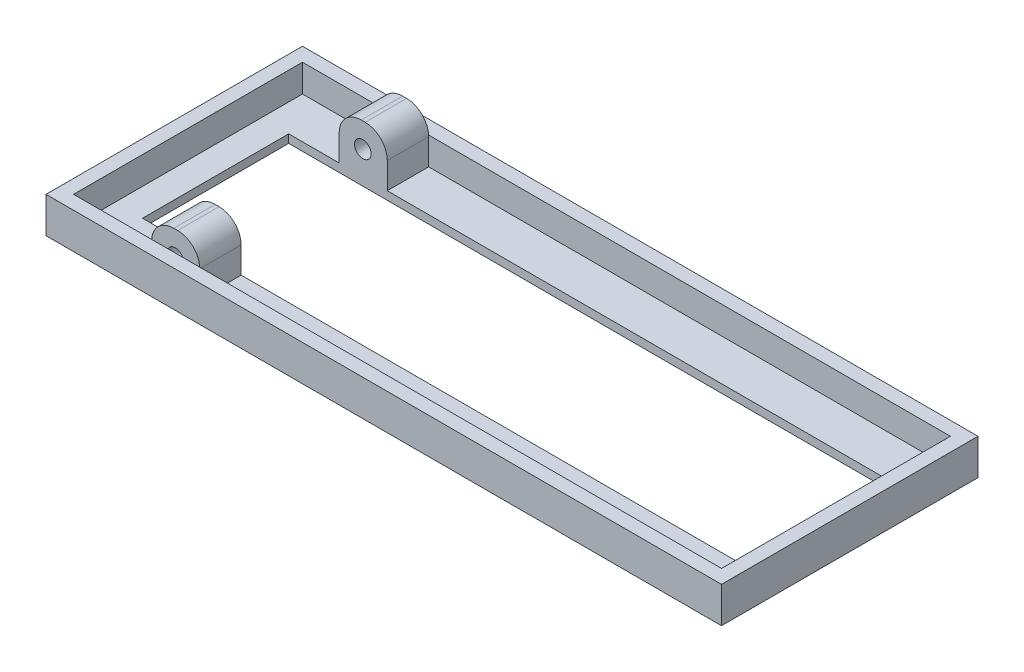
ISO-10303-21;
HEADER;
FILE_DESCRIPTION(('STEP AP214'),'2;1');
FILE_NAME('part.step','',(''),(''),'','','');
FILE_SCHEMA(('AUTOMOTIVE_DESIGN { 1 0 10303 214 1 1 1 1 }'));
ENDSEC;
DATA;
#1=APPLICATION_CONTEXT('core data for automotive mechanical design processes');
#2=APPLICATION_PROTOCOL_DEFINITION('international standard','automotive_design',2000,#1);
#3=PRODUCT_CONTEXT('',#1,'mechanical');
#4=PRODUCT('Part','Part','',(#3));
#5=PRODUCT_RELATED_PRODUCT_CATEGORY('part','',(#4));
#6=PRODUCT_DEFINITION_FORMATION('','',#4);
#7=PRODUCT_DEFINITION_CONTEXT('part definition',#1,'design');
#8=PRODUCT_DEFINITION('design','',#6,#7);
#9=PRODUCT_DEFINITION_SHAPE('','',#8);
#10=(LENGTH_UNIT() NAMED_UNIT(*) SI_UNIT(.MILLI.,.METRE.));
#11=(NAMED_UNIT(*) PLANE_ANGLE_UNIT() SI_UNIT($,.RADIAN.));
#12=(NAMED_UNIT(*) SI_UNIT($,.STERADIAN.) SOLID_ANGLE_UNIT());
#13=UNCERTAINTY_MEASURE_WITH_UNIT(LENGTH_MEASURE(1.E-05),#10,'distance_accuracy_value','');
#14=(GEOMETRIC_REPRESENTATION_CONTEXT(3) GLOBAL_UNCERTAINTY_ASSIGNED_CONTEXT((#13)) GLOBAL_UNIT_ASSIGNED_CONTEXT((#10,
#11,#12)) REPRESENTATION_CONTEXT('',''));
#15=CARTESIAN_POINT('',(0.,0.,0.));
#16=DIRECTION('',(0.,0.,1.));
#17=DIRECTION('',(1.,0.,0.));
#18=AXIS2_PLACEMENT_3D('',#15,#16,#17);
#19=CARTESIAN_POINT('',(1275.81442908691,30.,-600.220757140236));
#20=DIRECTION('',(0.,0.,-1.));
#21=DIRECTION('',(-1.,0.,0.));
#22=AXIS2_PLACEMENT_3D('',#19,#20,#21);
#23=PLANE('',#22);
#24=DIRECTION('',(-1.,0.,0.));
#25=VECTOR('',#24,1.);
#26=CARTESIAN_POINT('',(1458.88627271866,205.,-600.220757140236));
#27=LINE('',#26,#25);
#28=CARTESIAN_POINT('',(1553.30337059465,205.,-600.220757140236));
#29=VERTEX_POINT('',#28);
#30=CARTESIAN_POINT('',(1538.88627271866,205.,-600.220757140236));
#31=VERTEX_POINT('',#30);
#32=EDGE_CURVE('E460',#29,#31,#27,.T.);
#33=ORIENTED_EDGE('',*,*,#32,.F.);
#34=CARTESIAN_POINT('',(1553.30337059465,125.,-600.220757140236));
#35=DIRECTION('',(0.,0.,-1.));
#36=DIRECTION('',(-1.,0.,0.));
#37=AXIS2_PLACEMENT_3D('',#34,#35,#36);
#38=CIRCLE('',#37,80.);
#39=CARTESIAN_POINT('',(1633.30337059465,125.,-600.220757140236));
#40=VERTEX_POINT('',#39);
#41=EDGE_CURVE('E364',#29,#40,#38,.T.);
#42=ORIENTED_EDGE('',*,*,#41,.T.);
#43=DIRECTION('',(0.,-1.,0.));
#44=VECTOR('',#43,1.);
#45=CARTESIAN_POINT('',(1633.30337059465,205.,-600.220757140236));
#46=LINE('',#45,#44);
#47=CARTESIAN_POINT('',(1633.30337059465,30.,-600.220757140236));
#48=VERTEX_POINT('',#47);
#49=EDGE_CURVE('E427',#40,#48,#46,.T.);
#50=ORIENTED_EDGE('',*,*,#49,.T.);
#51=DIRECTION('',(1.,0.,0.));
#52=VECTOR('',#51,1.);
#53=CARTESIAN_POINT('',(1275.81442908691,30.,-600.220757140236));
#54=LINE('',#53,#52);
#55=CARTESIAN_POINT('',(3425.3144290869,30.,-600.220757140236));
#56=VERTEX_POINT('',#55);
#57=EDGE_CURVE('E293',#48,#56,#54,.T.);
#58=ORIENTED_EDGE('',*,*,#57,.T.);
#59=DIRECTION('',(0.,-1.,0.));
#60=VECTOR('',#59,1.);
#61=CARTESIAN_POINT('',(3425.3144290869,30.,-600.220757140236));
#62=LINE('',#61,#60);
#63=CARTESIAN_POINT('',(3425.3144290869,0.,-600.220757140236));
#64=VERTEX_POINT('',#63);
#65=EDGE_CURVE('E320',#56,#64,#62,.T.);
#66=ORIENTED_EDGE('',*,*,#65,.T.);
#67=DIRECTION('',(1.,0.,0.));
#68=VECTOR('',#67,1.);
#69=CARTESIAN_POINT('',(1275.81442908691,0.,-600.220757140236));
#70=LINE('',#69,#68);
#71=CARTESIAN_POINT('',(1275.81442908691,0.,-600.220757140236));
#72=VERTEX_POINT('',#71);
#73=EDGE_CURVE('E308',#72,#64,#70,.T.);
#74=ORIENTED_EDGE('',*,*,#73,.F.);
#75=DIRECTION('',(0.,-1.,0.));
#76=VECTOR('',#75,1.);
#77=CARTESIAN_POINT('',(1275.81442908691,30.,-600.220757140236));
#78=LINE('',#77,#76);
#79=CARTESIAN_POINT('',(1275.81442908691,30.,-600.220757140236));
#80=VERTEX_POINT('',#79);
#81=EDGE_CURVE('E322',#80,#72,#78,.T.);
#82=ORIENTED_EDGE('',*,*,#81,.F.);
#83=CARTESIAN_POINT('',(1458.88627271866,30.,-600.220757140236));
#84=VERTEX_POINT('',#83);
#85=EDGE_CURVE('E295',#80,#84,#54,.T.);
#86=ORIENTED_EDGE('',*,*,#85,.T.);
#87=DIRECTION('',(0.,-1.,0.));
#88=VECTOR('',#87,1.);
#89=CARTESIAN_POINT('',(1458.88627271866,205.,-600.220757140236));
#90=LINE('',#89,#88);
#91=CARTESIAN_POINT('',(1458.88627271866,125.,-600.220757140236));
#92=VERTEX_POINT('',#91);
#93=EDGE_CURVE('E464',#92,#84,#90,.T.);
#94=ORIENTED_EDGE('',*,*,#93,.F.);
#95=CARTESIAN_POINT('',(1538.88627271866,125.,-600.220757140236));
#96=DIRECTION('',(0.,0.,-1.));
#97=DIRECTION('',(-1.,0.,0.));
#98=AXIS2_PLACEMENT_3D('',#95,#96,#97);
#99=CIRCLE('',#98,80.);
#100=EDGE_CURVE('E362',#92,#31,#99,.T.);
#101=ORIENTED_EDGE('',*,*,#100,.T.);
#102=EDGE_LOOP('',(#33,#42,#50,#58,#66,#74,#82,#86,#94,#101));
#103=FACE_BOUND('',#102,.T.);
#104=CARTESIAN_POINT('',(1544.62599986394,116.419579705896,-600.220757140236));
#105=DIRECTION('',(0.,0.,-1.));
#106=DIRECTION('',(-1.,0.,0.));
#107=AXIS2_PLACEMENT_3D('',#104,#105,#106);
#108=CIRCLE('',#107,30.);
#109=CARTESIAN_POINT('',(1514.62599986394,116.419579705896,-600.220757140236));
#110=VERTEX_POINT('',#109);
#111=EDGE_CURVE('E453',#110,#110,#108,.F.);
#112=ORIENTED_EDGE('',*,*,#111,.T.);
#113=EDGE_LOOP('',(#112));
#114=FACE_BOUND('',#113,.T.);
#115=ADVANCED_FACE('F32',(#103,#114),#23,.T.);
#116=CARTESIAN_POINT('',(1275.81442908691,30.,-1130.22075714024));
#117=DIRECTION('',(0.,0.,1.));
#118=DIRECTION('',(1.,0.,0.));
#119=AXIS2_PLACEMENT_3D('',#116,#117,#118);
#120=PLANE('',#119);
#121=DIRECTION('',(1.,0.,0.));
#122=VECTOR('',#121,1.);
#123=CARTESIAN_POINT('',(1458.88627271866,205.,-1130.22075714024));
#124=LINE('',#123,#122);
#125=CARTESIAN_POINT('',(1538.88627271866,205.,-1130.22075714024));
#126=VERTEX_POINT('',#125);
#127=CARTESIAN_POINT('',(1553.30337059465,205.,-1130.22075714024));
#128=VERTEX_POINT('',#127);
#129=EDGE_CURVE('E418',#126,#128,#124,.T.);
#130=ORIENTED_EDGE('',*,*,#129,.F.);
#131=CARTESIAN_POINT('',(1538.88627271866,125.,-1130.22075714024));
#132=DIRECTION('',(0.,0.,1.));
#133=DIRECTION('',(1.,0.,0.));
#134=AXIS2_PLACEMENT_3D('',#131,#132,#133);
#135=CIRCLE('',#134,80.);
#136=CARTESIAN_POINT('',(1458.88627271866,125.,-1130.22075714024));
#137=VERTEX_POINT('',#136);
#138=EDGE_CURVE('E381',#126,#137,#135,.T.);
#139=ORIENTED_EDGE('',*,*,#138,.T.);
#140=DIRECTION('',(0.,-1.,0.));
#141=VECTOR('',#140,1.);
#142=CARTESIAN_POINT('',(1458.88627271866,205.,-1130.22075714024));
#143=LINE('',#142,#141);
#144=CARTESIAN_POINT('',(1458.88627271866,30.,-1130.22075714024));
#145=VERTEX_POINT('',#144);
#146=EDGE_CURVE('E433',#137,#145,#143,.T.);
#147=ORIENTED_EDGE('',*,*,#146,.T.);
#148=DIRECTION('',(-1.,0.,0.));
#149=VECTOR('',#148,1.);
#150=CARTESIAN_POINT('',(1275.81442908691,30.,-1130.22075714024));
#151=LINE('',#150,#149);
#152=CARTESIAN_POINT('',(1275.81442908691,30.,-1130.22075714024));
#153=VERTEX_POINT('',#152);
#154=EDGE_CURVE('E301',#145,#153,#151,.T.);
#155=ORIENTED_EDGE('',*,*,#154,.T.);
#156=DIRECTION('',(0.,-1.,0.));
#157=VECTOR('',#156,1.);
#158=CARTESIAN_POINT('',(1275.81442908691,30.,-1130.22075714024));
#159=LINE('',#158,#157);
#160=CARTESIAN_POINT('',(1275.81442908691,0.,-1130.22075714024));
#161=VERTEX_POINT('',#160);
#162=EDGE_CURVE('E305',#153,#161,#159,.T.);
#163=ORIENTED_EDGE('',*,*,#162,.T.);
#164=DIRECTION('',(-1.,0.,0.));
#165=VECTOR('',#164,1.);
#166=CARTESIAN_POINT('',(1275.81442908691,0.,-1130.22075714024));
#167=LINE('',#166,#165);
#168=CARTESIAN_POINT('',(3425.3144290869,0.,-1130.22075714024));
#169=VERTEX_POINT('',#168);
#170=EDGE_CURVE('E294',#169,#161,#167,.T.);
#171=ORIENTED_EDGE('',*,*,#170,.F.);
#172=DIRECTION('',(0.,-1.,0.));
#173=VECTOR('',#172,1.);
#174=CARTESIAN_POINT('',(3425.3144290869,30.,-1130.22075714024));
#175=LINE('',#174,#173);
#176=CARTESIAN_POINT('',(3425.3144290869,30.,-1130.22075714024));
#177=VERTEX_POINT('',#176);
#178=EDGE_CURVE('E318',#177,#169,#175,.T.);
#179=ORIENTED_EDGE('',*,*,#178,.F.);
#180=CARTESIAN_POINT('',(1633.30337059465,30.,-1130.22075714024));
#181=VERTEX_POINT('',#180);
#182=EDGE_CURVE('E302',#177,#181,#151,.T.);
#183=ORIENTED_EDGE('',*,*,#182,.T.);
#184=DIRECTION('',(0.,-1.,0.));
#185=VECTOR('',#184,1.);
#186=CARTESIAN_POINT('',(1633.30337059465,205.,-1130.22075714024));
#187=LINE('',#186,#185);
#188=CARTESIAN_POINT('',(1633.30337059465,125.,-1130.22075714024));
#189=VERTEX_POINT('',#188);
#190=EDGE_CURVE('E421',#189,#181,#187,.T.);
#191=ORIENTED_EDGE('',*,*,#190,.F.);
#192=CARTESIAN_POINT('',(1553.30337059465,125.,-1130.22075714024));
#193=DIRECTION('',(0.,0.,1.));
#194=DIRECTION('',(1.,0.,0.));
#195=AXIS2_PLACEMENT_3D('',#192,#193,#194);
#196=CIRCLE('',#195,80.);
#197=EDGE_CURVE('E379',#189,#128,#196,.T.);
#198=ORIENTED_EDGE('',*,*,#197,.T.);
#199=EDGE_LOOP('',(#130,#139,#147,#155,#163,#171,#179,#183,#191,#198));
#200=FACE_BOUND('',#199,.T.);
#201=CARTESIAN_POINT('',(1544.62599986394,116.419579705896,-1130.22075714024));
#202=DIRECTION('',(0.,0.,1.));
#203=DIRECTION('',(1.,0.,0.));
#204=AXIS2_PLACEMENT_3D('',#201,#202,#203);
#205=CIRCLE('',#204,30.);
#206=CARTESIAN_POINT('',(1574.62599986394,116.419579705896,-1130.22075714024));
#207=VERTEX_POINT('',#206);
#208=EDGE_CURVE('E237',#207,#207,#205,.F.);
#209=ORIENTED_EDGE('',*,*,#208,.T.);
#210=EDGE_LOOP('',(#209));
#211=FACE_BOUND('',#210,.T.);
#212=ADVANCED_FACE('F500',(#200,#211),#120,.T.);
#213=CARTESIAN_POINT('',(1458.88627271866,205.,-1280.22075714024));
#214=DIRECTION('',(0.,0.,1.));
#215=DIRECTION('',(1.,0.,0.));
#216=AXIS2_PLACEMENT_3D('',#213,#214,#215);
#217=PLANE('',#216);
#218=DIRECTION('',(-1.,0.,0.));
#219=VECTOR('',#218,1.);
#220=CARTESIAN_POINT('',(1175.81442908691,130.,-1280.22075714024));
#221=LINE('',#220,#219);
#222=CARTESIAN_POINT('',(1517.87581884333,130.,-1280.22075714024));
#223=VERTEX_POINT('',#222);
#224=CARTESIAN_POINT('',(1459.0426756053,130.,-1280.22075714024));
#225=VERTEX_POINT('',#224);
#226=EDGE_CURVE('E412',#223,#225,#221,.T.);
#227=ORIENTED_EDGE('',*,*,#226,.T.);
#228=CARTESIAN_POINT('',(1538.88627271866,125.,-1280.22075714024));
#229=DIRECTION('',(0.,0.,1.));
#230=DIRECTION('',(1.,0.,0.));
#231=AXIS2_PLACEMENT_3D('',#228,#229,#230);
#232=CIRCLE('',#231,80.);
#233=CARTESIAN_POINT('',(1538.88627271866,205.,-1280.22075714024));
#234=VERTEX_POINT('',#233);
#235=EDGE_CURVE('E388',#225,#234,#232,.F.);
#236=ORIENTED_EDGE('',*,*,#235,.T.);
#237=DIRECTION('',(-1.,0.,0.));
#238=VECTOR('',#237,1.);
#239=CARTESIAN_POINT('',(1458.88627271866,205.,-1280.22075714024));
#240=LINE('',#239,#238);
#241=CARTESIAN_POINT('',(1553.30337059465,205.,-1280.22075714024));
#242=VERTEX_POINT('',#241);
#243=EDGE_CURVE('E410',#242,#234,#240,.T.);
#244=ORIENTED_EDGE('',*,*,#243,.F.);
#245=CARTESIAN_POINT('',(1553.30337059465,125.,-1280.22075714024));
#246=DIRECTION('',(0.,0.,1.));
#247=DIRECTION('',(1.,0.,0.));
#248=AXIS2_PLACEMENT_3D('',#245,#246,#247);
#249=CIRCLE('',#248,80.);
#250=CARTESIAN_POINT('',(1633.14696770801,130.,-1280.22075714024));
#251=VERTEX_POINT('',#250);
#252=EDGE_CURVE('E385',#242,#251,#249,.F.);
#253=ORIENTED_EDGE('',*,*,#252,.T.);
#254=CARTESIAN_POINT('',(1571.37618088455,130.,-1280.22075714024));
#255=VERTEX_POINT('',#254);
#256=EDGE_CURVE('E436',#251,#255,#221,.T.);
#257=ORIENTED_EDGE('',*,*,#256,.T.);
#258=CARTESIAN_POINT('',(1544.62599986394,116.419579705896,-1280.22075714024));
#259=DIRECTION('',(0.,0.,1.));
#260=DIRECTION('',(1.,0.,0.));
#261=AXIS2_PLACEMENT_3D('',#258,#259,#260);
#262=CIRCLE('',#261,30.);
#263=EDGE_CURVE('E234',#255,#223,#262,.T.);
#264=ORIENTED_EDGE('',*,*,#263,.T.);
#265=EDGE_LOOP('',(#227,#236,#244,#253,#257,#264));
#266=FACE_BOUND('',#265,.T.);
#267=ADVANCED_FACE('F409',(#266),#217,.F.);
#268=CARTESIAN_POINT('',(1458.88627271866,205.,-450.220757140228));
#269=DIRECTION('',(0.,0.,-1.));
#270=DIRECTION('',(-1.,0.,0.));
#271=AXIS2_PLACEMENT_3D('',#268,#269,#270);
#272=PLANE('',#271);
#273=DIRECTION('',(1.,0.,0.));
#274=VECTOR('',#273,1.);
#275=CARTESIAN_POINT('',(1175.81442908691,130.,-450.220757140236));
#276=LINE('',#275,#274);
#277=CARTESIAN_POINT('',(1571.37618088455,130.,-450.220757140228));
#278=VERTEX_POINT('',#277);
#279=CARTESIAN_POINT('',(1633.14696770801,130.,-450.220757140238));
#280=VERTEX_POINT('',#279);
#281=EDGE_CURVE('E228',#278,#280,#276,.T.);
#282=ORIENTED_EDGE('',*,*,#281,.T.);
#283=CARTESIAN_POINT('',(1553.30337059465,125.,-450.220757140228));
#284=DIRECTION('',(0.,0.,-1.));
#285=DIRECTION('',(-1.,0.,0.));
#286=AXIS2_PLACEMENT_3D('',#283,#284,#285);
#287=CIRCLE('',#286,80.);
#288=CARTESIAN_POINT('',(1553.30337059465,205.,-450.220757140228));
#289=VERTEX_POINT('',#288);
#290=EDGE_CURVE('E369',#280,#289,#287,.F.);
#291=ORIENTED_EDGE('',*,*,#290,.T.);
#292=DIRECTION('',(1.,0.,0.));
#293=VECTOR('',#292,1.);
#294=CARTESIAN_POINT('',(1458.88627271866,205.,-450.220757140228));
#295=LINE('',#294,#293);
#296=CARTESIAN_POINT('',(1538.88627271866,205.,-450.220757140228));
#297=VERTEX_POINT('',#296);
#298=EDGE_CURVE('E457',#297,#289,#295,.T.);
#299=ORIENTED_EDGE('',*,*,#298,.F.);
#300=CARTESIAN_POINT('',(1538.88627271866,125.,-450.220757140228));
#301=DIRECTION('',(0.,0.,-1.));
#302=DIRECTION('',(-1.,0.,0.));
#303=AXIS2_PLACEMENT_3D('',#300,#301,#302);
#304=CIRCLE('',#303,80.);
#305=CARTESIAN_POINT('',(1459.0426756053,130.,-450.220757140237));
#306=VERTEX_POINT('',#305);
#307=EDGE_CURVE('E221',#297,#306,#304,.F.);
#308=ORIENTED_EDGE('',*,*,#307,.T.);
#309=CARTESIAN_POINT('',(1517.87581884333,130.,-450.220757140235));
#310=VERTEX_POINT('',#309);
#311=EDGE_CURVE('E213',#306,#310,#276,.T.);
#312=ORIENTED_EDGE('',*,*,#311,.T.);
#313=CARTESIAN_POINT('',(1544.62599986394,116.419579705896,-450.220757140235));
#314=DIRECTION('',(0.,0.,1.));
#315=DIRECTION('',(1.,0.,0.));
#316=AXIS2_PLACEMENT_3D('',#313,#314,#315);
#317=CIRCLE('',#316,30.);
#318=EDGE_CURVE('E218',#278,#310,#317,.T.);
#319=ORIENTED_EDGE('',*,*,#318,.F.);
#320=EDGE_LOOP('',(#282,#291,#299,#308,#312,#319));
#321=FACE_BOUND('',#320,.T.);
#322=ADVANCED_FACE('F216',(#321),#272,.F.);
#323=CARTESIAN_POINT('',(0.,30.,0.));
#324=DIRECTION('',(0.,1.,0.));
#325=DIRECTION('',(0.,0.,1.));
#326=AXIS2_PLACEMENT_3D('',#323,#324,#325);
#327=PLANE('',#326);
#328=DIRECTION('',(1.,0.,0.));
#329=VECTOR('',#328,1.);
#330=CARTESIAN_POINT('',(1175.81442908691,30.,-450.220757140236));
#331=LINE('',#330,#329);
#332=CARTESIAN_POINT('',(1175.81442908691,30.,-450.220757140236));
#333=VERTEX_POINT('',#332);
#334=CARTESIAN_POINT('',(1458.88627271866,30.,-450.220757140228));
#335=VERTEX_POINT('',#334);
#336=EDGE_CURVE('E266',#333,#335,#331,.T.);
#337=ORIENTED_EDGE('',*,*,#336,.T.);
#338=DIRECTION('',(0.,0.,1.));
#339=VECTOR('',#338,1.);
#340=CARTESIAN_POINT('',(1458.88627271866,30.,-600.220757140236));
#341=LINE('',#340,#339);
#342=EDGE_CURVE('E456',#84,#335,#341,.T.);
#343=ORIENTED_EDGE('',*,*,#342,.F.);
#344=ORIENTED_EDGE('',*,*,#85,.F.);
#345=DIRECTION('',(0.,0.,1.));
#346=VECTOR('',#345,1.);
#347=CARTESIAN_POINT('',(1275.81442908691,30.,-1130.22075714024));
#348=LINE('',#347,#346);
#349=EDGE_CURVE('E291',#153,#80,#348,.T.);
#350=ORIENTED_EDGE('',*,*,#349,.F.);
#351=ORIENTED_EDGE('',*,*,#154,.F.);
#352=DIRECTION('',(0.,0.,1.));
#353=VECTOR('',#352,1.);
#354=CARTESIAN_POINT('',(1458.88627271866,30.,-1130.22075714024));
#355=LINE('',#354,#353);
#356=CARTESIAN_POINT('',(1458.88627271866,30.,-1280.22075714024));
#357=VERTEX_POINT('',#356);
#358=EDGE_CURVE('E419',#357,#145,#355,.T.);
#359=ORIENTED_EDGE('',*,*,#358,.F.);
#360=DIRECTION('',(-1.,0.,0.));
#361=VECTOR('',#360,1.);
#362=CARTESIAN_POINT('',(1175.81442908691,30.,-1280.22075714024));
#363=LINE('',#362,#361);
#364=CARTESIAN_POINT('',(1175.81442908691,30.,-1280.22075714024));
#365=VERTEX_POINT('',#364);
#366=EDGE_CURVE('E263',#357,#365,#363,.T.);
#367=ORIENTED_EDGE('',*,*,#366,.T.);
#368=DIRECTION('',(0.,0.,1.));
#369=VECTOR('',#368,1.);
#370=CARTESIAN_POINT('',(1175.81442908691,30.,-1280.22075714024));
#371=LINE('',#370,#369);
#372=EDGE_CURVE('E262',#365,#333,#371,.T.);
#373=ORIENTED_EDGE('',*,*,#372,.T.);
#374=EDGE_LOOP('',(#337,#343,#344,#350,#351,#359,#367,#373));
#375=FACE_BOUND('',#374,.T.);
#376=ADVANCED_FACE('F504',(#375),#327,.T.);
#377=ORIENTED_EDGE('',*,*,#57,.F.);
#378=DIRECTION('',(0.,0.,-1.));
#379=VECTOR('',#378,1.);
#380=CARTESIAN_POINT('',(1633.30337059465,30.,-600.220757140236));
#381=LINE('',#380,#379);
#382=CARTESIAN_POINT('',(1633.30337059465,30.,-450.220757140228));
#383=VERTEX_POINT('',#382);
#384=EDGE_CURVE('E461',#383,#48,#381,.T.);
#385=ORIENTED_EDGE('',*,*,#384,.F.);
#386=CARTESIAN_POINT('',(3525.31442908691,30.,-450.220757140244));
#387=VERTEX_POINT('',#386);
#388=EDGE_CURVE('E265',#383,#387,#331,.T.);
#389=ORIENTED_EDGE('',*,*,#388,.T.);
#390=DIRECTION('',(0.,0.,-1.));
#391=VECTOR('',#390,1.);
#392=CARTESIAN_POINT('',(3525.3144290869,30.,-1280.22075714024));
#393=LINE('',#392,#391);
#394=CARTESIAN_POINT('',(3525.3144290869,30.,-1280.22075714024));
#395=VERTEX_POINT('',#394);
#396=EDGE_CURVE('E269',#387,#395,#393,.T.);
#397=ORIENTED_EDGE('',*,*,#396,.T.);
#398=CARTESIAN_POINT('',(1633.30337059465,30.,-1280.22075714024));
#399=VERTEX_POINT('',#398);
#400=EDGE_CURVE('E259',#395,#399,#363,.T.);
#401=ORIENTED_EDGE('',*,*,#400,.T.);
#402=DIRECTION('',(0.,0.,-1.));
#403=VECTOR('',#402,1.);
#404=CARTESIAN_POINT('',(1633.30337059465,30.,-1130.22075714024));
#405=LINE('',#404,#403);
#406=EDGE_CURVE('E424',#181,#399,#405,.T.);
#407=ORIENTED_EDGE('',*,*,#406,.F.);
#408=ORIENTED_EDGE('',*,*,#182,.F.);
#409=DIRECTION('',(0.,0.,-1.));
#410=VECTOR('',#409,1.);
#411=CARTESIAN_POINT('',(3425.3144290869,30.,-1130.22075714024));
#412=LINE('',#411,#410);
#413=EDGE_CURVE('E298',#56,#177,#412,.T.);
#414=ORIENTED_EDGE('',*,*,#413,.F.);
#415=EDGE_LOOP('',(#377,#385,#389,#397,#401,#407,#408,#414));
#416=FACE_BOUND('',#415,.T.);
#417=ADVANCED_FACE('F484',(#416),#327,.T.);
#418=CARTESIAN_POINT('',(1175.81442908691,130.,-450.220757140236));
#419=DIRECTION('',(0.,0.,-1.));
#420=DIRECTION('',(-1.,0.,0.));
#421=AXIS2_PLACEMENT_3D('',#418,#419,#420);
#422=PLANE('',#421);
#423=CARTESIAN_POINT('',(1175.81442908691,130.,-450.220757140236));
#424=VERTEX_POINT('',#423);
#425=EDGE_CURVE('E225',#424,#306,#276,.T.);
#426=ORIENTED_EDGE('',*,*,#425,.T.);
#427=CARTESIAN_POINT('',(1538.88627271866,125.,-450.220757140237));
#428=DIRECTION('',(0.,0.,-1.));
#429=DIRECTION('',(-1.,0.,0.));
#430=AXIS2_PLACEMENT_3D('',#427,#428,#429);
#431=CIRCLE('',#430,80.);
#432=CARTESIAN_POINT('',(1458.88627271866,125.,-450.220757140237));
#433=VERTEX_POINT('',#432);
#434=EDGE_CURVE('E394',#306,#433,#431,.F.);
#435=ORIENTED_EDGE('',*,*,#434,.T.);
#436=DIRECTION('',(0.,-1.,0.));
#437=VECTOR('',#436,1.);
#438=CARTESIAN_POINT('',(1458.88627271866,130.,-450.220757140237));
#439=LINE('',#438,#437);
#440=EDGE_CURVE('E354',#433,#335,#439,.T.);
#441=ORIENTED_EDGE('',*,*,#440,.T.);
#442=ORIENTED_EDGE('',*,*,#336,.F.);
#443=DIRECTION('',(0.,-1.,0.));
#444=VECTOR('',#443,1.);
#445=CARTESIAN_POINT('',(1175.81442908691,130.,-450.220757140236));
#446=LINE('',#445,#444);
#447=EDGE_CURVE('E272',#424,#333,#446,.T.);
#448=ORIENTED_EDGE('',*,*,#447,.F.);
#449=EDGE_LOOP('',(#426,#435,#441,#442,#448));
#450=FACE_BOUND('',#449,.T.);
#451=ADVANCED_FACE('F587',(#450),#422,.T.);
#452=ORIENTED_EDGE('',*,*,#388,.F.);
#453=DIRECTION('',(0.,1.,0.));
#454=VECTOR('',#453,1.);
#455=CARTESIAN_POINT('',(1633.30337059465,130.,-450.220757140238));
#456=LINE('',#455,#454);
#457=CARTESIAN_POINT('',(1633.30337059465,125.,-450.220757140238));
#458=VERTEX_POINT('',#457);
#459=EDGE_CURVE('E351',#383,#458,#456,.T.);
#460=ORIENTED_EDGE('',*,*,#459,.T.);
#461=CARTESIAN_POINT('',(1553.30337059465,125.,-450.220757140237));
#462=DIRECTION('',(0.,0.,-1.));
#463=DIRECTION('',(-1.,0.,0.));
#464=AXIS2_PLACEMENT_3D('',#461,#462,#463);
#465=CIRCLE('',#464,80.);
#466=EDGE_CURVE('E392',#458,#280,#465,.F.);
#467=ORIENTED_EDGE('',*,*,#466,.T.);
#468=CARTESIAN_POINT('',(3525.31442908691,130.,-450.220757140244));
#469=VERTEX_POINT('',#468);
#470=EDGE_CURVE('E239',#280,#469,#276,.T.);
#471=ORIENTED_EDGE('',*,*,#470,.T.);
#472=DIRECTION('',(0.,-1.,0.));
#473=VECTOR('',#472,1.);
#474=CARTESIAN_POINT('',(3525.31442908691,130.,-450.220757140244));
#475=LINE('',#474,#473);
#476=EDGE_CURVE('E256',#469,#387,#475,.T.);
#477=ORIENTED_EDGE('',*,*,#476,.T.);
#478=EDGE_LOOP('',(#452,#460,#467,#471,#477));
#479=FACE_BOUND('',#478,.T.);
#480=ADVANCED_FACE('F518',(#479),#422,.T.);
#481=CARTESIAN_POINT('',(1175.81442908691,130.,-1280.22075714024));
#482=DIRECTION('',(0.,0.,1.));
#483=DIRECTION('',(1.,0.,0.));
#484=AXIS2_PLACEMENT_3D('',#481,#482,#483);
#485=PLANE('',#484);
#486=CARTESIAN_POINT('',(3525.3144290869,130.,-1280.22075714024));
#487=VERTEX_POINT('',#486);
#488=EDGE_CURVE('E247',#487,#251,#221,.T.);
#489=ORIENTED_EDGE('',*,*,#488,.T.);
#490=CARTESIAN_POINT('',(1553.30337059465,125.,-1280.22075714024));
#491=DIRECTION('',(0.,0.,1.));
#492=DIRECTION('',(1.,0.,0.));
#493=AXIS2_PLACEMENT_3D('',#490,#491,#492);
#494=CIRCLE('',#493,80.);
#495=CARTESIAN_POINT('',(1633.30337059465,125.,-1280.22075714024));
#496=VERTEX_POINT('',#495);
#497=EDGE_CURVE('E11',#251,#496,#494,.F.);
#498=ORIENTED_EDGE('',*,*,#497,.T.);
#499=DIRECTION('',(0.,-1.,0.));
#500=VECTOR('',#499,1.);
#501=CARTESIAN_POINT('',(1633.30337059465,130.,-1280.22075714024));
#502=LINE('',#501,#500);
#503=EDGE_CURVE('E349',#496,#399,#502,.T.);
#504=ORIENTED_EDGE('',*,*,#503,.T.);
#505=ORIENTED_EDGE('',*,*,#400,.F.);
#506=DIRECTION('',(0.,-1.,0.));
#507=VECTOR('',#506,1.);
#508=CARTESIAN_POINT('',(3525.3144290869,130.,-1280.22075714024));
#509=LINE('',#508,#507);
#510=EDGE_CURVE('E251',#487,#395,#509,.T.);
#511=ORIENTED_EDGE('',*,*,#510,.F.);
#512=EDGE_LOOP('',(#489,#498,#504,#505,#511));
#513=FACE_BOUND('',#512,.T.);
#514=ADVANCED_FACE('F521',(#513),#485,.T.);
#515=ORIENTED_EDGE('',*,*,#366,.F.);
#516=DIRECTION('',(0.,1.,0.));
#517=VECTOR('',#516,1.);
#518=CARTESIAN_POINT('',(1458.88627271866,130.,-1280.22075714024));
#519=LINE('',#518,#517);
#520=CARTESIAN_POINT('',(1458.88627271866,125.,-1280.22075714024));
#521=VERTEX_POINT('',#520);
#522=EDGE_CURVE('E346',#357,#521,#519,.T.);
#523=ORIENTED_EDGE('',*,*,#522,.T.);
#524=CARTESIAN_POINT('',(1538.88627271866,125.,-1280.22075714024));
#525=DIRECTION('',(0.,0.,1.));
#526=DIRECTION('',(1.,0.,0.));
#527=AXIS2_PLACEMENT_3D('',#524,#525,#526);
#528=CIRCLE('',#527,80.);
#529=EDGE_CURVE('E41',#521,#225,#528,.F.);
#530=ORIENTED_EDGE('',*,*,#529,.T.);
#531=CARTESIAN_POINT('',(1175.81442908691,130.,-1280.22075714024));
#532=VERTEX_POINT('',#531);
#533=EDGE_CURVE('E48',#225,#532,#221,.T.);
#534=ORIENTED_EDGE('',*,*,#533,.T.);
#535=DIRECTION('',(0.,-1.,0.));
#536=VECTOR('',#535,1.);
#537=CARTESIAN_POINT('',(1175.81442908691,130.,-1280.22075714024));
#538=LINE('',#537,#536);
#539=EDGE_CURVE('E275',#532,#365,#538,.T.);
#540=ORIENTED_EDGE('',*,*,#539,.T.);
#541=EDGE_LOOP('',(#515,#523,#530,#534,#540));
#542=FACE_BOUND('',#541,.T.);
#543=ADVANCED_FACE('F400',(#542),#485,.T.);
#544=CARTESIAN_POINT('',(0.,0.,0.));
#545=DIRECTION('',(0.,1.,0.));
#546=DIRECTION('',(0.,0.,1.));
#547=AXIS2_PLACEMENT_3D('',#544,#545,#546);
#548=PLANE('',#547);
#549=DIRECTION('',(0.,0.,1.));
#550=VECTOR('',#549,1.);
#551=CARTESIAN_POINT('',(1125.81442908691,0.,-1330.22075714024));
#552=LINE('',#551,#550);
#553=CARTESIAN_POINT('',(1125.81442908691,0.,-1330.22075714024));
#554=VERTEX_POINT('',#553);
#555=CARTESIAN_POINT('',(1125.81442908691,0.,-400.220757140236));
#556=VERTEX_POINT('',#555);
#557=EDGE_CURVE('E325',#554,#556,#552,.T.);
#558=ORIENTED_EDGE('',*,*,#557,.F.);
#559=DIRECTION('',(-1.,0.,0.));
#560=VECTOR('',#559,1.);
#561=CARTESIAN_POINT('',(1125.81442908691,0.,-1330.22075714024));
#562=LINE('',#561,#560);
#563=CARTESIAN_POINT('',(3575.3144290869,0.,-1330.22075714024));
#564=VERTEX_POINT('',#563);
#565=EDGE_CURVE('E332',#564,#554,#562,.T.);
#566=ORIENTED_EDGE('',*,*,#565,.F.);
#567=DIRECTION('',(0.,0.,-1.));
#568=VECTOR('',#567,1.);
#569=CARTESIAN_POINT('',(3575.3144290869,0.,-1330.22075714024));
#570=LINE('',#569,#568);
#571=CARTESIAN_POINT('',(3575.3144290869,0.,-400.220757140236));
#572=VERTEX_POINT('',#571);
#573=EDGE_CURVE('E330',#572,#564,#570,.T.);
#574=ORIENTED_EDGE('',*,*,#573,.F.);
#575=DIRECTION('',(1.,0.,0.));
#576=VECTOR('',#575,1.);
#577=CARTESIAN_POINT('',(1125.81442908691,0.,-400.220757140236));
#578=LINE('',#577,#576);
#579=EDGE_CURVE('E328',#556,#572,#578,.T.);
#580=ORIENTED_EDGE('',*,*,#579,.F.);
#581=EDGE_LOOP('',(#558,#566,#574,#580));
#582=FACE_BOUND('',#581,.T.);
#583=DIRECTION('',(0.,0.,1.));
#584=VECTOR('',#583,1.);
#585=CARTESIAN_POINT('',(1275.81442908691,0.,-1130.22075714024));
#586=LINE('',#585,#584);
#587=EDGE_CURVE('E290',#161,#72,#586,.T.);
#588=ORIENTED_EDGE('',*,*,#587,.T.);
#589=ORIENTED_EDGE('',*,*,#73,.T.);
#590=DIRECTION('',(0.,0.,-1.));
#591=VECTOR('',#590,1.);
#592=CARTESIAN_POINT('',(3425.3144290869,0.,-1130.22075714024));
#593=LINE('',#592,#591);
#594=EDGE_CURVE('E311',#64,#169,#593,.T.);
#595=ORIENTED_EDGE('',*,*,#594,.T.);
#596=ORIENTED_EDGE('',*,*,#170,.T.);
#597=EDGE_LOOP('',(#588,#589,#595,#596));
#598=FACE_BOUND('',#597,.T.);
#599=ADVANCED_FACE('F498',(#582,#598),#548,.F.);
#600=CARTESIAN_POINT('',(1125.81442908691,30.,-1330.22075714024));
#601=DIRECTION('',(1.,0.,0.));
#602=DIRECTION('',(0.,0.,-1.));
#603=AXIS2_PLACEMENT_3D('',#600,#601,#602);
#604=PLANE('',#603);
#605=ORIENTED_EDGE('',*,*,#557,.T.);
#606=DIRECTION('',(0.,-1.,0.));
#607=VECTOR('',#606,1.);
#608=CARTESIAN_POINT('',(1125.81442908691,30.,-400.220757140236));
#609=LINE('',#608,#607);
#610=CARTESIAN_POINT('',(1125.81442908691,130.,-400.220757140236));
#611=VERTEX_POINT('',#610);
#612=EDGE_CURVE('E343',#611,#556,#609,.T.);
#613=ORIENTED_EDGE('',*,*,#612,.F.);
#614=DIRECTION('',(0.,0.,1.));
#615=VECTOR('',#614,1.);
#616=CARTESIAN_POINT('',(1125.81442908691,130.,-1330.22075714024));
#617=LINE('',#616,#615);
#618=CARTESIAN_POINT('',(1125.81442908691,130.,-1330.22075714024));
#619=VERTEX_POINT('',#618);
#620=EDGE_CURVE('E284',#619,#611,#617,.T.);
#621=ORIENTED_EDGE('',*,*,#620,.F.);
#622=DIRECTION('',(0.,-1.,0.));
#623=VECTOR('',#622,1.);
#624=CARTESIAN_POINT('',(1125.81442908691,30.,-1330.22075714024));
#625=LINE('',#624,#623);
#626=EDGE_CURVE('E334',#619,#554,#625,.T.);
#627=ORIENTED_EDGE('',*,*,#626,.T.);
#628=EDGE_LOOP('',(#605,#613,#621,#627));
#629=FACE_BOUND('',#628,.T.);
#630=ADVANCED_FACE('F553',(#629),#604,.F.);
#631=CARTESIAN_POINT('',(1125.81442908691,30.,-400.220757140236));
#632=DIRECTION('',(0.,0.,-1.));
#633=DIRECTION('',(-1.,0.,0.));
#634=AXIS2_PLACEMENT_3D('',#631,#632,#633);
#635=PLANE('',#634);
#636=ORIENTED_EDGE('',*,*,#579,.T.);
#637=DIRECTION('',(0.,-1.,0.));
#638=VECTOR('',#637,1.);
#639=CARTESIAN_POINT('',(3575.3144290869,30.,-400.220757140236));
#640=LINE('',#639,#638);
#641=CARTESIAN_POINT('',(3575.31442908691,130.,-400.220757140244));
#642=VERTEX_POINT('',#641);
#643=EDGE_CURVE('E340',#642,#572,#640,.T.);
#644=ORIENTED_EDGE('',*,*,#643,.F.);
#645=DIRECTION('',(1.,0.,0.));
#646=VECTOR('',#645,1.);
#647=CARTESIAN_POINT('',(1125.81442908691,130.,-400.220757140236));
#648=LINE('',#647,#646);
#649=EDGE_CURVE('E287',#611,#642,#648,.T.);
#650=ORIENTED_EDGE('',*,*,#649,.F.);
#651=ORIENTED_EDGE('',*,*,#612,.T.);
#652=EDGE_LOOP('',(#636,#644,#650,#651));
#653=FACE_BOUND('',#652,.T.);
#654=ADVANCED_FACE('F561',(#653),#635,.F.);
#655=CARTESIAN_POINT('',(3575.3144290869,30.,-1330.22075714024));
#656=DIRECTION('',(-1.,0.,0.));
#657=DIRECTION('',(0.,0.,1.));
#658=AXIS2_PLACEMENT_3D('',#655,#656,#657);
#659=PLANE('',#658);
#660=ORIENTED_EDGE('',*,*,#573,.T.);
#661=DIRECTION('',(0.,-1.,0.));
#662=VECTOR('',#661,1.);
#663=CARTESIAN_POINT('',(3575.3144290869,30.,-1330.22075714024));
#664=LINE('',#663,#662);
#665=CARTESIAN_POINT('',(3575.3144290869,130.,-1330.22075714024));
#666=VERTEX_POINT('',#665);
#667=EDGE_CURVE('E337',#666,#564,#664,.T.);
#668=ORIENTED_EDGE('',*,*,#667,.F.);
#669=DIRECTION('',(0.,0.,-1.));
#670=VECTOR('',#669,1.);
#671=CARTESIAN_POINT('',(3575.3144290869,130.,-1330.22075714024));
#672=LINE('',#671,#670);
#673=EDGE_CURVE('E278',#642,#666,#672,.T.);
#674=ORIENTED_EDGE('',*,*,#673,.F.);
#675=ORIENTED_EDGE('',*,*,#643,.T.);
#676=EDGE_LOOP('',(#660,#668,#674,#675));
#677=FACE_BOUND('',#676,.T.);
#678=ADVANCED_FACE('F557',(#677),#659,.F.);
#679=CARTESIAN_POINT('',(1125.81442908691,30.,-1330.22075714024));
#680=DIRECTION('',(0.,0.,1.));
#681=DIRECTION('',(1.,0.,0.));
#682=AXIS2_PLACEMENT_3D('',#679,#680,#681);
#683=PLANE('',#682);
#684=ORIENTED_EDGE('',*,*,#565,.T.);
#685=ORIENTED_EDGE('',*,*,#626,.F.);
#686=DIRECTION('',(-1.,0.,0.));
#687=VECTOR('',#686,1.);
#688=CARTESIAN_POINT('',(3575.3144290869,130.,-1330.22075714024));
#689=LINE('',#688,#687);
#690=EDGE_CURVE('E281',#666,#619,#689,.T.);
#691=ORIENTED_EDGE('',*,*,#690,.F.);
#692=ORIENTED_EDGE('',*,*,#667,.T.);
#693=EDGE_LOOP('',(#684,#685,#691,#692));
#694=FACE_BOUND('',#693,.T.);
#695=ADVANCED_FACE('F548',(#694),#683,.F.);
#696=CARTESIAN_POINT('',(1275.81442908691,30.,-1130.22075714024));
#697=DIRECTION('',(1.,0.,0.));
#698=DIRECTION('',(0.,0.,-1.));
#699=AXIS2_PLACEMENT_3D('',#696,#697,#698);
#700=PLANE('',#699);
#701=ORIENTED_EDGE('',*,*,#587,.F.);
#702=ORIENTED_EDGE('',*,*,#162,.F.);
#703=ORIENTED_EDGE('',*,*,#349,.T.);
#704=ORIENTED_EDGE('',*,*,#81,.T.);
#705=EDGE_LOOP('',(#701,#702,#703,#704));
#706=FACE_BOUND('',#705,.T.);
#707=ADVANCED_FACE('F495',(#706),#700,.T.);
#708=CARTESIAN_POINT('',(3425.3144290869,30.,-1130.22075714024));
#709=DIRECTION('',(-1.,0.,0.));
#710=DIRECTION('',(0.,0.,1.));
#711=AXIS2_PLACEMENT_3D('',#708,#709,#710);
#712=PLANE('',#711);
#713=ORIENTED_EDGE('',*,*,#594,.F.);
#714=ORIENTED_EDGE('',*,*,#65,.F.);
#715=ORIENTED_EDGE('',*,*,#413,.T.);
#716=ORIENTED_EDGE('',*,*,#178,.T.);
#717=EDGE_LOOP('',(#713,#714,#715,#716));
#718=FACE_BOUND('',#717,.T.);
#719=ADVANCED_FACE('F489',(#718),#712,.T.);
#720=CARTESIAN_POINT('',(0.,130.,0.));
#721=DIRECTION('',(0.,1.,0.));
#722=DIRECTION('',(0.,0.,1.));
#723=AXIS2_PLACEMENT_3D('',#720,#721,#722);
#724=PLANE('',#723);
#725=ORIENTED_EDGE('',*,*,#673,.T.);
#726=ORIENTED_EDGE('',*,*,#690,.T.);
#727=ORIENTED_EDGE('',*,*,#620,.T.);
#728=ORIENTED_EDGE('',*,*,#649,.T.);
#729=EDGE_LOOP('',(#725,#726,#727,#728));
#730=FACE_BOUND('',#729,.T.);
#731=DIRECTION('',(0.,0.,1.));
#732=VECTOR('',#731,1.);
#733=CARTESIAN_POINT('',(1175.81442908691,130.,-1280.22075714024));
#734=LINE('',#733,#732);
#735=EDGE_CURVE('E242',#532,#424,#734,.T.);
#736=ORIENTED_EDGE('',*,*,#735,.F.);
#737=ORIENTED_EDGE('',*,*,#533,.F.);
#738=ORIENTED_EDGE('',*,*,#226,.F.);
#739=EDGE_CURVE('E439',#255,#223,#221,.T.);
#740=ORIENTED_EDGE('',*,*,#739,.F.);
#741=ORIENTED_EDGE('',*,*,#256,.F.);
#742=ORIENTED_EDGE('',*,*,#488,.F.);
#743=DIRECTION('',(0.,0.,-1.));
#744=VECTOR('',#743,1.);
#745=CARTESIAN_POINT('',(3525.3144290869,130.,-1280.22075714024));
#746=LINE('',#745,#744);
#747=EDGE_CURVE('E248',#469,#487,#746,.T.);
#748=ORIENTED_EDGE('',*,*,#747,.F.);
#749=ORIENTED_EDGE('',*,*,#470,.F.);
#750=ORIENTED_EDGE('',*,*,#281,.F.);
#751=EDGE_CURVE('E226',#310,#278,#276,.T.);
#752=ORIENTED_EDGE('',*,*,#751,.F.);
#753=ORIENTED_EDGE('',*,*,#311,.F.);
#754=ORIENTED_EDGE('',*,*,#425,.F.);
#755=EDGE_LOOP('',(#736,#737,#738,#740,#741,#742,#748,#749,#750,#752,#753,#754));
#756=FACE_BOUND('',#755,.T.);
#757=ADVANCED_FACE('F238',(#730,#756),#724,.T.);
#758=CARTESIAN_POINT('',(1175.81442908691,130.,-1280.22075714024));
#759=DIRECTION('',(1.,0.,0.));
#760=DIRECTION('',(0.,0.,-1.));
#761=AXIS2_PLACEMENT_3D('',#758,#759,#760);
#762=PLANE('',#761);
#763=ORIENTED_EDGE('',*,*,#372,.F.);
#764=ORIENTED_EDGE('',*,*,#539,.F.);
#765=ORIENTED_EDGE('',*,*,#735,.T.);
#766=ORIENTED_EDGE('',*,*,#447,.T.);
#767=EDGE_LOOP('',(#763,#764,#765,#766));
#768=FACE_BOUND('',#767,.T.);
#769=ADVANCED_FACE('F526',(#768),#762,.T.);
#770=CARTESIAN_POINT('',(3525.3144290869,130.,-1280.22075714024));
#771=DIRECTION('',(-1.,0.,0.));
#772=DIRECTION('',(0.,0.,1.));
#773=AXIS2_PLACEMENT_3D('',#770,#771,#772);
#774=PLANE('',#773);
#775=ORIENTED_EDGE('',*,*,#396,.F.);
#776=ORIENTED_EDGE('',*,*,#476,.F.);
#777=ORIENTED_EDGE('',*,*,#747,.T.);
#778=ORIENTED_EDGE('',*,*,#510,.T.);
#779=EDGE_LOOP('',(#775,#776,#777,#778));
#780=FACE_BOUND('',#779,.T.);
#781=ADVANCED_FACE('F523',(#780),#774,.T.);
#782=CARTESIAN_POINT('',(1633.30337059465,205.,-1130.22075714024));
#783=DIRECTION('',(-1.,0.,0.));
#784=DIRECTION('',(0.,0.,1.));
#785=AXIS2_PLACEMENT_3D('',#782,#783,#784);
#786=PLANE('',#785);
#787=ORIENTED_EDGE('',*,*,#503,.F.);
#788=DIRECTION('',(0.,0.,-1.));
#789=VECTOR('',#788,1.);
#790=CARTESIAN_POINT('',(1633.30337059465,125.,-1130.22075714024));
#791=LINE('',#790,#789);
#792=EDGE_CURVE('E390',#496,#189,#791,.F.);
#793=ORIENTED_EDGE('',*,*,#792,.T.);
#794=ORIENTED_EDGE('',*,*,#190,.T.);
#795=ORIENTED_EDGE('',*,*,#406,.T.);
#796=EDGE_LOOP('',(#787,#793,#794,#795));
#797=FACE_BOUND('',#796,.T.);
#798=ADVANCED_FACE('F525',(#797),#786,.F.);
#799=CARTESIAN_POINT('',(1458.88627271866,205.,-1130.22075714024));
#800=DIRECTION('',(1.,0.,0.));
#801=DIRECTION('',(0.,0.,-1.));
#802=AXIS2_PLACEMENT_3D('',#799,#800,#801);
#803=PLANE('',#802);
#804=ORIENTED_EDGE('',*,*,#146,.F.);
#805=DIRECTION('',(0.,0.,1.));
#806=VECTOR('',#805,1.);
#807=CARTESIAN_POINT('',(1458.88627271866,125.,-1130.22075714024));
#808=LINE('',#807,#806);
#809=EDGE_CURVE('E383',#137,#521,#808,.F.);
#810=ORIENTED_EDGE('',*,*,#809,.T.);
#811=ORIENTED_EDGE('',*,*,#522,.F.);
#812=ORIENTED_EDGE('',*,*,#358,.T.);
#813=EDGE_LOOP('',(#804,#810,#811,#812));
#814=FACE_BOUND('',#813,.T.);
#815=ADVANCED_FACE('F532',(#814),#803,.F.);
#816=CARTESIAN_POINT('',(0.,205.,0.));
#817=DIRECTION('',(0.,-1.,0.));
#818=DIRECTION('',(0.,0.,-1.));
#819=AXIS2_PLACEMENT_3D('',#816,#817,#818);
#820=PLANE('',#819);
#821=ORIENTED_EDGE('',*,*,#243,.T.);
#822=DIRECTION('',(0.,0.,1.));
#823=VECTOR('',#822,1.);
#824=CARTESIAN_POINT('',(1538.88627271866,205.,0.));
#825=LINE('',#824,#823);
#826=EDGE_CURVE('E376',#234,#126,#825,.T.);
#827=ORIENTED_EDGE('',*,*,#826,.T.);
#828=ORIENTED_EDGE('',*,*,#129,.T.);
#829=DIRECTION('',(0.,0.,-1.));
#830=VECTOR('',#829,1.);
#831=CARTESIAN_POINT('',(1553.30337059465,205.,0.));
#832=LINE('',#831,#830);
#833=EDGE_CURVE('E373',#128,#242,#832,.T.);
#834=ORIENTED_EDGE('',*,*,#833,.T.);
#835=EDGE_LOOP('',(#821,#827,#828,#834));
#836=FACE_BOUND('',#835,.T.);
#837=ADVANCED_FACE('F414',(#836),#820,.F.);
#838=CARTESIAN_POINT('',(1458.88627271866,205.,-600.220757140236));
#839=DIRECTION('',(1.,0.,0.));
#840=DIRECTION('',(0.,0.,-1.));
#841=AXIS2_PLACEMENT_3D('',#838,#839,#840);
#842=PLANE('',#841);
#843=ORIENTED_EDGE('',*,*,#440,.F.);
#844=DIRECTION('',(0.,0.,1.));
#845=VECTOR('',#844,1.);
#846=CARTESIAN_POINT('',(1458.88627271866,125.,-600.220757140236));
#847=LINE('',#846,#845);
#848=EDGE_CURVE('E371',#433,#92,#847,.F.);
#849=ORIENTED_EDGE('',*,*,#848,.T.);
#850=ORIENTED_EDGE('',*,*,#93,.T.);
#851=ORIENTED_EDGE('',*,*,#342,.T.);
#852=EDGE_LOOP('',(#843,#849,#850,#851));
#853=FACE_BOUND('',#852,.T.);
#854=ADVANCED_FACE('F589',(#853),#842,.F.);
#855=CARTESIAN_POINT('',(1633.30337059465,205.,-600.220757140236));
#856=DIRECTION('',(-1.,0.,0.));
#857=DIRECTION('',(0.,0.,1.));
#858=AXIS2_PLACEMENT_3D('',#855,#856,#857);
#859=PLANE('',#858);
#860=ORIENTED_EDGE('',*,*,#49,.F.);
#861=DIRECTION('',(0.,0.,-1.));
#862=VECTOR('',#861,1.);
#863=CARTESIAN_POINT('',(1633.30337059465,125.,-450.220757140228));
#864=LINE('',#863,#862);
#865=EDGE_CURVE('E366',#40,#458,#864,.F.);
#866=ORIENTED_EDGE('',*,*,#865,.T.);
#867=ORIENTED_EDGE('',*,*,#459,.F.);
#868=ORIENTED_EDGE('',*,*,#384,.T.);
#869=EDGE_LOOP('',(#860,#866,#867,#868));
#870=FACE_BOUND('',#869,.T.);
#871=ADVANCED_FACE('F480',(#870),#859,.F.);
#872=CARTESIAN_POINT('',(0.,205.,0.));
#873=DIRECTION('',(0.,1.,0.));
#874=DIRECTION('',(0.,0.,1.));
#875=AXIS2_PLACEMENT_3D('',#872,#873,#874);
#876=PLANE('',#875);
#877=ORIENTED_EDGE('',*,*,#298,.T.);
#878=DIRECTION('',(0.,0.,-1.));
#879=VECTOR('',#878,1.);
#880=CARTESIAN_POINT('',(1553.30337059465,205.,-600.220757140236));
#881=LINE('',#880,#879);
#882=EDGE_CURVE('E359',#289,#29,#881,.T.);
#883=ORIENTED_EDGE('',*,*,#882,.T.);
#884=ORIENTED_EDGE('',*,*,#32,.T.);
#885=DIRECTION('',(0.,0.,1.));
#886=VECTOR('',#885,1.);
#887=CARTESIAN_POINT('',(1538.88627271866,205.,-450.220757140228));
#888=LINE('',#887,#886);
#889=EDGE_CURVE('E356',#31,#297,#888,.T.);
#890=ORIENTED_EDGE('',*,*,#889,.T.);
#891=EDGE_LOOP('',(#877,#883,#884,#890));
#892=FACE_BOUND('',#891,.T.);
#893=ADVANCED_FACE('F512',(#892),#876,.T.);
#894=CARTESIAN_POINT('',(1544.62599986394,116.419579705896,-450.220757140235));
#895=DIRECTION('',(0.,0.,-1.));
#896=DIRECTION('',(-1.,0.,0.));
#897=AXIS2_PLACEMENT_3D('',#894,#895,#896);
#898=CYLINDRICAL_SURFACE('',#897,30.);
#899=ORIENTED_EDGE('',*,*,#111,.F.);
#900=EDGE_LOOP('',(#899));
#901=FACE_BOUND('',#900,.T.);
#902=ORIENTED_EDGE('',*,*,#318,.T.);
#903=EDGE_CURVE('E231',#310,#278,#317,.T.);
#904=ORIENTED_EDGE('',*,*,#903,.T.);
#905=EDGE_LOOP('',(#902,#904));
#906=FACE_BOUND('',#905,.T.);
#907=ADVANCED_FACE('F236',(#901,#906),#898,.F.);
#908=CARTESIAN_POINT('',(1544.62599986394,116.419579705896,-450.220757140235));
#909=DIRECTION('',(0.,0.,1.));
#910=DIRECTION('',(1.,0.,0.));
#911=AXIS2_PLACEMENT_3D('',#908,#909,#910);
#912=PLANE('',#911);
#913=ORIENTED_EDGE('',*,*,#751,.T.);
#914=ORIENTED_EDGE('',*,*,#903,.F.);
#915=EDGE_LOOP('',(#913,#914));
#916=FACE_BOUND('',#915,.T.);
#917=ADVANCED_FACE('F232',(#916),#912,.F.);
#918=ORIENTED_EDGE('',*,*,#208,.F.);
#919=EDGE_LOOP('',(#918));
#920=FACE_BOUND('',#919,.T.);
#921=ORIENTED_EDGE('',*,*,#263,.F.);
#922=EDGE_CURVE('E445',#223,#255,#262,.T.);
#923=ORIENTED_EDGE('',*,*,#922,.F.);
#924=EDGE_LOOP('',(#921,#923));
#925=FACE_BOUND('',#924,.T.);
#926=ADVANCED_FACE('F760',(#920,#925),#898,.F.);
#927=CARTESIAN_POINT('',(1544.62599986394,116.419579705896,-1280.22075714024));
#928=DIRECTION('',(0.,0.,1.));
#929=DIRECTION('',(1.,0.,0.));
#930=AXIS2_PLACEMENT_3D('',#927,#928,#929);
#931=PLANE('',#930);
#932=ORIENTED_EDGE('',*,*,#922,.T.);
#933=ORIENTED_EDGE('',*,*,#739,.T.);
#934=EDGE_LOOP('',(#932,#933));
#935=FACE_BOUND('',#934,.T.);
#936=ADVANCED_FACE('F444',(#935),#931,.T.);
#937=CARTESIAN_POINT('',(1553.30337059465,125.,0.));
#938=DIRECTION('',(0.,0.,1.));
#939=DIRECTION('',(1.,0.,0.));
#940=AXIS2_PLACEMENT_3D('',#937,#938,#939);
#941=CYLINDRICAL_SURFACE('',#940,80.);
#942=ORIENTED_EDGE('',*,*,#466,.F.);
#943=ORIENTED_EDGE('',*,*,#865,.F.);
#944=ORIENTED_EDGE('',*,*,#41,.F.);
#945=ORIENTED_EDGE('',*,*,#882,.F.);
#946=ORIENTED_EDGE('',*,*,#290,.F.);
#947=EDGE_LOOP('',(#942,#943,#944,#945,#946));
#948=FACE_BOUND('',#947,.T.);
#949=ADVANCED_FACE('F517',(#948),#941,.T.);
#950=CARTESIAN_POINT('',(1538.88627271866,125.,0.));
#951=DIRECTION('',(0.,0.,-1.));
#952=DIRECTION('',(-1.,0.,0.));
#953=AXIS2_PLACEMENT_3D('',#950,#951,#952);
#954=CYLINDRICAL_SURFACE('',#953,80.);
#955=ORIENTED_EDGE('',*,*,#100,.F.);
#956=ORIENTED_EDGE('',*,*,#848,.F.);
#957=ORIENTED_EDGE('',*,*,#434,.F.);
#958=ORIENTED_EDGE('',*,*,#307,.F.);
#959=ORIENTED_EDGE('',*,*,#889,.F.);
#960=EDGE_LOOP('',(#955,#956,#957,#958,#959));
#961=FACE_BOUND('',#960,.T.);
#962=ADVANCED_FACE('F510',(#961),#954,.T.);
#963=CARTESIAN_POINT('',(1538.88627271866,125.,0.));
#964=DIRECTION('',(0.,0.,1.));
#965=DIRECTION('',(1.,0.,0.));
#966=AXIS2_PLACEMENT_3D('',#963,#964,#965);
#967=CYLINDRICAL_SURFACE('',#966,80.);
#968=ORIENTED_EDGE('',*,*,#529,.F.);
#969=ORIENTED_EDGE('',*,*,#809,.F.);
#970=ORIENTED_EDGE('',*,*,#138,.F.);
#971=ORIENTED_EDGE('',*,*,#826,.F.);
#972=ORIENTED_EDGE('',*,*,#235,.F.);
#973=EDGE_LOOP('',(#968,#969,#970,#971,#972));
#974=FACE_BOUND('',#973,.T.);
#975=ADVANCED_FACE('F405',(#974),#967,.T.);
#976=CARTESIAN_POINT('',(1553.30337059465,125.,0.));
#977=DIRECTION('',(0.,0.,-1.));
#978=DIRECTION('',(-1.,0.,0.));
#979=AXIS2_PLACEMENT_3D('',#976,#977,#978);
#980=CYLINDRICAL_SURFACE('',#979,80.);
#981=ORIENTED_EDGE('',*,*,#197,.F.);
#982=ORIENTED_EDGE('',*,*,#792,.F.);
#983=ORIENTED_EDGE('',*,*,#497,.F.);
#984=ORIENTED_EDGE('',*,*,#252,.F.);
#985=ORIENTED_EDGE('',*,*,#833,.F.);
#986=EDGE_LOOP('',(#981,#982,#983,#984,#985));
#987=FACE_BOUND('',#986,.T.);
#988=ADVANCED_FACE('F34',(#987),#980,.T.);
#989=CLOSED_SHELL('',(#115,#212,#267,#322,#376,#417,#451,#480,#514,#543,#599,#630,#654,#678,
#695,#707,#719,#757,#769,#781,#798,#815,#837,#854,#871,#893,#907,#917,#926,#936,#949,#962,#975,#988));
#990=MANIFOLD_SOLID_BREP('B2',#989);
#991=ADVANCED_BREP_SHAPE_REPRESENTATION('',(#18,#990),#14);
#992=SHAPE_DEFINITION_REPRESENTATION(#9,#991);
ENDSEC;
END-ISO-10303-21;
